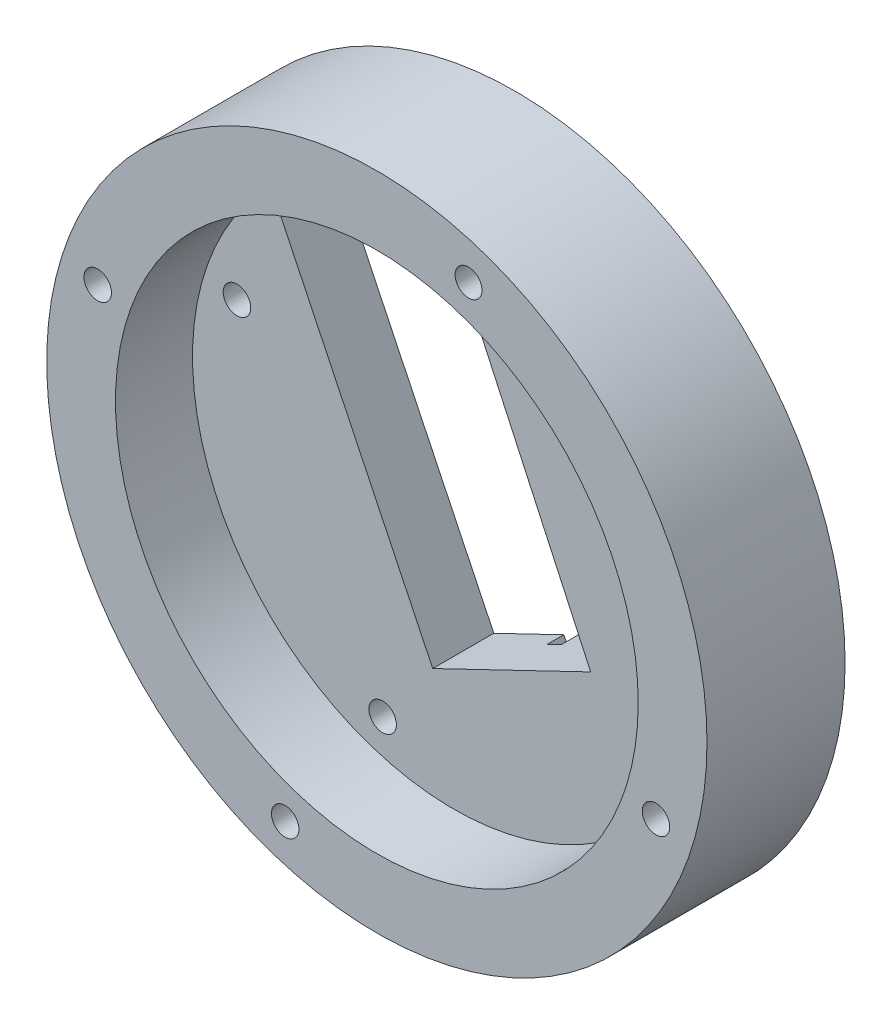
ISO-10303-21;
HEADER;
FILE_DESCRIPTION(('STEP AP214'),'2;1');
FILE_NAME('part.step','',(''),(''),'','','');
FILE_SCHEMA(('AUTOMOTIVE_DESIGN { 1 0 10303 214 1 1 1 1 }'));
ENDSEC;
DATA;
#1=APPLICATION_CONTEXT('core data for automotive mechanical design processes');
#2=APPLICATION_PROTOCOL_DEFINITION('international standard','automotive_design',2000,#1);
#3=PRODUCT_CONTEXT('',#1,'mechanical');
#4=PRODUCT('Part','Part','',(#3));
#5=PRODUCT_RELATED_PRODUCT_CATEGORY('part','',(#4));
#6=PRODUCT_DEFINITION_FORMATION('','',#4);
#7=PRODUCT_DEFINITION_CONTEXT('part definition',#1,'design');
#8=PRODUCT_DEFINITION('design','',#6,#7);
#9=PRODUCT_DEFINITION_SHAPE('','',#8);
#10=(LENGTH_UNIT() NAMED_UNIT(*) SI_UNIT(.MILLI.,.METRE.));
#11=(NAMED_UNIT(*) PLANE_ANGLE_UNIT() SI_UNIT($,.RADIAN.));
#12=(NAMED_UNIT(*) SI_UNIT($,.STERADIAN.) SOLID_ANGLE_UNIT());
#13=UNCERTAINTY_MEASURE_WITH_UNIT(LENGTH_MEASURE(1.E-05),#10,'distance_accuracy_value','');
#14=(GEOMETRIC_REPRESENTATION_CONTEXT(3) GLOBAL_UNCERTAINTY_ASSIGNED_CONTEXT((#13)) GLOBAL_UNIT_ASSIGNED_CONTEXT((#10,
#11,#12)) REPRESENTATION_CONTEXT('',''));
#15=CARTESIAN_POINT('',(0.,0.,0.));
#16=DIRECTION('',(0.,0.,1.));
#17=DIRECTION('',(1.,0.,0.));
#18=AXIS2_PLACEMENT_3D('',#15,#16,#17);
#19=CARTESIAN_POINT('',(0.,0.,25.1));
#20=DIRECTION('',(0.,0.,-1.));
#21=DIRECTION('',(-1.,0.,0.));
#22=AXIS2_PLACEMENT_3D('',#19,#20,#21);
#23=CYLINDRICAL_SURFACE('',#22,60.);
#24=CARTESIAN_POINT('',(0.,0.,25.1));
#25=DIRECTION('',(0.,0.,1.));
#26=DIRECTION('',(1.,0.,0.));
#27=AXIS2_PLACEMENT_3D('',#24,#25,#26);
#28=CIRCLE('',#27,60.);
#29=CARTESIAN_POINT('',(60.,0.,25.1));
#30=VERTEX_POINT('',#29);
#31=EDGE_CURVE('E277',#30,#30,#28,.T.);
#32=ORIENTED_EDGE('',*,*,#31,.F.);
#33=EDGE_LOOP('',(#32));
#34=FACE_BOUND('',#33,.T.);
#35=CARTESIAN_POINT('',(0.,0.,0.));
#36=DIRECTION('',(0.,0.,1.));
#37=DIRECTION('',(1.,0.,0.));
#38=AXIS2_PLACEMENT_3D('',#35,#36,#37);
#39=CIRCLE('',#38,60.);
#40=CARTESIAN_POINT('',(60.,0.,0.));
#41=VERTEX_POINT('',#40);
#42=EDGE_CURVE('E274',#41,#41,#39,.T.);
#43=ORIENTED_EDGE('',*,*,#42,.T.);
#44=EDGE_LOOP('',(#43));
#45=FACE_BOUND('',#44,.T.);
#46=ADVANCED_FACE('F38',(#34,#45),#23,.T.);
#47=CARTESIAN_POINT('',(0.,0.,25.1));
#48=DIRECTION('',(0.,0.,1.));
#49=DIRECTION('',(1.,0.,0.));
#50=AXIS2_PLACEMENT_3D('',#47,#48,#49);
#51=PLANE('',#50);
#52=CARTESIAN_POINT('',(-16.6646971454572,-50.7331044480832,25.1));
#53=DIRECTION('',(0.,0.,1.));
#54=DIRECTION('',(1.,0.,0.));
#55=AXIS2_PLACEMENT_3D('',#52,#53,#54);
#56=CIRCLE('',#55,2.49499865411322);
#57=CARTESIAN_POINT('',(-14.169698491344,-50.7331044480832,25.1));
#58=VERTEX_POINT('',#57);
#59=EDGE_CURVE('E267',#58,#58,#56,.T.);
#60=ORIENTED_EDGE('',*,*,#59,.F.);
#61=EDGE_LOOP('',(#60));
#62=FACE_BOUND('',#61,.T.);
#63=CARTESIAN_POINT('',(-50.7331051137993,16.6646965435116,25.1));
#64=DIRECTION('',(0.,0.,1.));
#65=DIRECTION('',(1.,0.,0.));
#66=AXIS2_PLACEMENT_3D('',#63,#64,#65);
#67=CIRCLE('',#66,2.50000000000001);
#68=CARTESIAN_POINT('',(-48.2331051137992,16.6646965435116,25.1));
#69=VERTEX_POINT('',#68);
#70=EDGE_CURVE('E264',#69,#69,#67,.T.);
#71=ORIENTED_EDGE('',*,*,#70,.F.);
#72=EDGE_LOOP('',(#71));
#73=FACE_BOUND('',#72,.T.);
#74=CARTESIAN_POINT('',(16.6646958777955,50.7331045118536,25.1));
#75=DIRECTION('',(0.,0.,1.));
#76=DIRECTION('',(1.,0.,0.));
#77=AXIS2_PLACEMENT_3D('',#74,#75,#76);
#78=CIRCLE('',#77,2.44444382902341);
#79=CARTESIAN_POINT('',(19.1091397068189,50.7331045118536,25.1));
#80=VERTEX_POINT('',#79);
#81=EDGE_CURVE('E261',#80,#80,#78,.T.);
#82=ORIENTED_EDGE('',*,*,#81,.F.);
#83=EDGE_LOOP('',(#82));
#84=FACE_BOUND('',#83,.T.);
#85=CARTESIAN_POINT('',(50.7331038461375,-16.6646964797411,25.1));
#86=DIRECTION('',(0.,0.,1.));
#87=DIRECTION('',(1.,0.,0.));
#88=AXIS2_PLACEMENT_3D('',#85,#86,#87);
#89=CIRCLE('',#88,2.5);
#90=CARTESIAN_POINT('',(53.2331038461375,-16.6646964797411,25.1));
#91=VERTEX_POINT('',#90);
#92=EDGE_CURVE('E250',#91,#91,#89,.T.);
#93=ORIENTED_EDGE('',*,*,#92,.F.);
#94=EDGE_LOOP('',(#93));
#95=FACE_BOUND('',#94,.T.);
#96=CARTESIAN_POINT('',(0.,0.,25.1));
#97=DIRECTION('',(0.,0.,1.));
#98=DIRECTION('',(1.,0.,0.));
#99=AXIS2_PLACEMENT_3D('',#96,#97,#98);
#100=CIRCLE('',#99,47.5);
#101=CARTESIAN_POINT('',(47.5,0.,25.1));
#102=VERTEX_POINT('',#101);
#103=EDGE_CURVE('E270',#102,#102,#100,.T.);
#104=ORIENTED_EDGE('',*,*,#103,.F.);
#105=EDGE_LOOP('',(#104));
#106=FACE_BOUND('',#105,.T.);
#107=ORIENTED_EDGE('',*,*,#31,.T.);
#108=EDGE_LOOP('',(#107));
#109=FACE_BOUND('',#108,.T.);
#110=ADVANCED_FACE('F348',(#62,#73,#84,#95,#106,#109),#51,.T.);
#111=CARTESIAN_POINT('',(0.,0.,0.));
#112=DIRECTION('',(0.,0.,1.));
#113=DIRECTION('',(1.,0.,0.));
#114=AXIS2_PLACEMENT_3D('',#111,#112,#113);
#115=PLANE('',#114);
#116=CARTESIAN_POINT('',(39.4274126053784,-12.9510283470174,0.));
#117=DIRECTION('',(0.,0.,-1.));
#118=DIRECTION('',(-1.,0.,0.));
#119=AXIS2_PLACEMENT_3D('',#116,#117,#118);
#120=CIRCLE('',#119,2.5);
#121=CARTESIAN_POINT('',(36.9274126053784,-12.9510283470174,0.));
#122=VERTEX_POINT('',#121);
#123=EDGE_CURVE('E184',#122,#122,#120,.T.);
#124=ORIENTED_EDGE('',*,*,#123,.F.);
#125=EDGE_LOOP('',(#124));
#126=FACE_BOUND('',#125,.T.);
#127=CARTESIAN_POINT('',(12.9510283470172,39.4274126053785,0.));
#128=DIRECTION('',(0.,0.,-1.));
#129=DIRECTION('',(-1.,0.,0.));
#130=AXIS2_PLACEMENT_3D('',#127,#128,#129);
#131=CIRCLE('',#130,2.50000000000001);
#132=CARTESIAN_POINT('',(10.4510283470172,39.4274126053785,0.));
#133=VERTEX_POINT('',#132);
#134=EDGE_CURVE('E188',#133,#133,#131,.T.);
#135=ORIENTED_EDGE('',*,*,#134,.F.);
#136=EDGE_LOOP('',(#135));
#137=FACE_BOUND('',#136,.T.);
#138=CARTESIAN_POINT('',(-39.4274126053785,12.9510283470171,0.));
#139=DIRECTION('',(0.,0.,-1.));
#140=DIRECTION('',(-1.,0.,0.));
#141=AXIS2_PLACEMENT_3D('',#138,#139,#140);
#142=CIRCLE('',#141,2.5);
#143=CARTESIAN_POINT('',(-41.9274126053785,12.9510283470171,0.));
#144=VERTEX_POINT('',#143);
#145=EDGE_CURVE('E191',#144,#144,#142,.T.);
#146=ORIENTED_EDGE('',*,*,#145,.F.);
#147=EDGE_LOOP('',(#146));
#148=FACE_BOUND('',#147,.T.);
#149=CARTESIAN_POINT('',(-12.9510283470169,-39.4274126053786,0.));
#150=DIRECTION('',(0.,0.,-1.));
#151=DIRECTION('',(-1.,0.,0.));
#152=AXIS2_PLACEMENT_3D('',#149,#150,#151);
#153=CIRCLE('',#152,2.50000000000001);
#154=CARTESIAN_POINT('',(-15.451028347017,-39.4274126053786,0.));
#155=VERTEX_POINT('',#154);
#156=EDGE_CURVE('E194',#155,#155,#153,.T.);
#157=ORIENTED_EDGE('',*,*,#156,.F.);
#158=EDGE_LOOP('',(#157));
#159=FACE_BOUND('',#158,.T.);
#160=DIRECTION('',(0.901037518718234,0.433741155370446,0.));
#161=VECTOR('',#160,1.);
#162=CARTESIAN_POINT('',(-3.84554959776519,-27.2732838043376,0.));
#163=LINE('',#162,#161);
#164=CARTESIAN_POINT('',(-3.84554959776519,-27.2732838043376,0.));
#165=VERTEX_POINT('',#164);
#166=CARTESIAN_POINT('',(8.88037510619848,-21.1472822010896,0.));
#167=VERTEX_POINT('',#166);
#168=EDGE_CURVE('E205',#165,#167,#163,.T.);
#169=ORIENTED_EDGE('',*,*,#168,.T.);
#170=DIRECTION('',(-0.433741155370446,0.901037518718233,0.));
#171=VECTOR('',#170,1.);
#172=CARTESIAN_POINT('',(8.88037510619848,-21.1472822010896,0.));
#173=LINE('',#172,#171);
#174=CARTESIAN_POINT('',(11.8841005405814,-27.387108140585,0.));
#175=VERTEX_POINT('',#174);
#176=EDGE_CURVE('E146',#175,#167,#173,.T.);
#177=ORIENTED_EDGE('',*,*,#176,.F.);
#178=DIRECTION('',(-0.901037518718233,-0.433741155370445,0.));
#179=VECTOR('',#178,1.);
#180=CARTESIAN_POINT('',(11.8841005405814,-27.387108140585,0.));
#181=LINE('',#180,#179);
#182=CARTESIAN_POINT('',(14.4408286590091,-26.1563511687416,0.));
#183=VERTEX_POINT('',#182);
#184=EDGE_CURVE('E328',#183,#175,#181,.T.);
#185=ORIENTED_EDGE('',*,*,#184,.F.);
#186=DIRECTION('',(0.433741155370446,-0.901037518718233,0.));
#187=VECTOR('',#186,1.);
#188=CARTESIAN_POINT('',(14.4408286590091,-26.1563511687416,0.));
#189=LINE('',#188,#187);
#190=CARTESIAN_POINT('',(11.4371032246262,-19.9165252292462,0.));
#191=VERTEX_POINT('',#190);
#192=EDGE_CURVE('E178',#191,#183,#189,.T.);
#193=ORIENTED_EDGE('',*,*,#192,.F.);
#194=CARTESIAN_POINT('',(24.8593227015866,-13.4553414687139,0.));
#195=VERTEX_POINT('',#194);
#196=EDGE_CURVE('E151',#191,#195,#163,.T.);
#197=ORIENTED_EDGE('',*,*,#196,.T.);
#198=DIRECTION('',(-0.419041540891961,0.907967062732394,0.));
#199=VECTOR('',#198,1.);
#200=CARTESIAN_POINT('',(24.8593227015866,-13.4553414687139,0.));
#201=LINE('',#200,#199);
#202=CARTESIAN_POINT('',(-3.04254959976023,47.001626554702,0.));
#203=VERTEX_POINT('',#202);
#204=EDGE_CURVE('E208',#195,#203,#201,.T.);
#205=ORIENTED_EDGE('',*,*,#204,.T.);
#206=DIRECTION('',(-0.901037518718234,-0.433741155370445,0.));
#207=VECTOR('',#206,1.);
#208=CARTESIAN_POINT('',(-3.04254959976023,47.001626554702,0.));
#209=LINE('',#208,#207);
#210=CARTESIAN_POINT('',(-16.5872007313895,40.4815066830236,0.));
#211=VERTEX_POINT('',#210);
#212=EDGE_CURVE('E198',#203,#211,#209,.T.);
#213=ORIENTED_EDGE('',*,*,#212,.T.);
#214=DIRECTION('',(0.433741155370445,-0.901037518718234,0.));
#215=VECTOR('',#214,1.);
#216=CARTESIAN_POINT('',(-19.6572411960768,46.85909296557,0.));
#217=LINE('',#216,#215);
#218=CARTESIAN_POINT('',(-19.6572411960768,46.85909296557,0.));
#219=VERTEX_POINT('',#218);
#220=EDGE_CURVE('E161',#219,#211,#217,.T.);
#221=ORIENTED_EDGE('',*,*,#220,.F.);
#222=DIRECTION('',(0.901037518718234,0.433741155370444,0.));
#223=VECTOR('',#222,1.);
#224=CARTESIAN_POINT('',(-22.3543810358794,45.5607446437645,0.));
#225=LINE('',#224,#223);
#226=CARTESIAN_POINT('',(-22.3543810358794,45.5607446437645,0.));
#227=VERTEX_POINT('',#226);
#228=EDGE_CURVE('E171',#227,#219,#225,.T.);
#229=ORIENTED_EDGE('',*,*,#228,.F.);
#230=DIRECTION('',(-0.433741155370445,0.901037518718234,0.));
#231=VECTOR('',#230,1.);
#232=CARTESIAN_POINT('',(-19.2843405711922,39.1831583612181,0.));
#233=LINE('',#232,#231);
#234=CARTESIAN_POINT('',(-19.2843405711922,39.1831583612181,0.));
#235=VERTEX_POINT('',#234);
#236=EDGE_CURVE('E168',#235,#227,#233,.T.);
#237=ORIENTED_EDGE('',*,*,#236,.F.);
#238=CARTESIAN_POINT('',(-32.7223817744969,32.7143583430695,0.));
#239=VERTEX_POINT('',#238);
#240=EDGE_CURVE('E202',#235,#239,#209,.T.);
#241=ORIENTED_EDGE('',*,*,#240,.T.);
#242=DIRECTION('',(0.433741155370445,-0.901037518718234,0.));
#243=VECTOR('',#242,1.);
#244=CARTESIAN_POINT('',(-32.7223817744969,32.7143583430695,0.));
#245=LINE('',#244,#243);
#246=EDGE_CURVE('E201',#239,#165,#245,.T.);
#247=ORIENTED_EDGE('',*,*,#246,.T.);
#248=EDGE_LOOP('',(#169,#177,#185,#193,#197,#205,#213,#221,#229,#237,#241,#247));
#249=FACE_BOUND('',#248,.T.);
#250=CARTESIAN_POINT('',(-11.9735029881181,47.2126105483995,0.));
#251=DIRECTION('',(0.,0.,-1.));
#252=DIRECTION('',(-1.,0.,0.));
#253=AXIS2_PLACEMENT_3D('',#250,#251,#252);
#254=CIRCLE('',#253,3.);
#255=CARTESIAN_POINT('',(-14.9735029881181,47.2126105483995,0.));
#256=VERTEX_POINT('',#255);
#257=EDGE_CURVE('E227',#256,#256,#254,.T.);
#258=ORIENTED_EDGE('',*,*,#257,.F.);
#259=EDGE_LOOP('',(#258));
#260=FACE_BOUND('',#259,.T.);
#261=CARTESIAN_POINT('',(-27.3812859892251,40.0292810285461,0.));
#262=DIRECTION('',(0.,0.,-1.));
#263=DIRECTION('',(-1.,0.,0.));
#264=AXIS2_PLACEMENT_3D('',#261,#262,#263);
#265=CIRCLE('',#264,3.);
#266=CARTESIAN_POINT('',(-30.3812859892251,40.0292810285461,0.));
#267=VERTEX_POINT('',#266);
#268=EDGE_CURVE('E233',#267,#267,#265,.T.);
#269=ORIENTED_EDGE('',*,*,#268,.F.);
#270=EDGE_LOOP('',(#269));
#271=FACE_BOUND('',#270,.T.);
#272=CARTESIAN_POINT('',(19.7176566582941,-20.7629026917785,0.));
#273=DIRECTION('',(0.,0.,-1.));
#274=DIRECTION('',(-1.,0.,0.));
#275=AXIS2_PLACEMENT_3D('',#272,#273,#274);
#276=CIRCLE('',#275,3.);
#277=CARTESIAN_POINT('',(16.7176566582941,-20.7629026917785,0.));
#278=VERTEX_POINT('',#277);
#279=EDGE_CURVE('E239',#278,#278,#276,.T.);
#280=ORIENTED_EDGE('',*,*,#279,.F.);
#281=EDGE_LOOP('',(#280));
#282=FACE_BOUND('',#281,.T.);
#283=CARTESIAN_POINT('',(4.30987365718704,-27.9462322116319,0.));
#284=DIRECTION('',(0.,0.,-1.));
#285=DIRECTION('',(-1.,0.,0.));
#286=AXIS2_PLACEMENT_3D('',#283,#284,#285);
#287=CIRCLE('',#286,3.);
#288=CARTESIAN_POINT('',(1.30987365718704,-27.9462322116319,0.));
#289=VERTEX_POINT('',#288);
#290=EDGE_CURVE('E215',#289,#289,#287,.T.);
#291=ORIENTED_EDGE('',*,*,#290,.F.);
#292=EDGE_LOOP('',(#291));
#293=FACE_BOUND('',#292,.T.);
#294=CARTESIAN_POINT('',(-16.6646971454572,-50.7331044480832,0.));
#295=DIRECTION('',(0.,0.,1.));
#296=DIRECTION('',(1.,0.,0.));
#297=AXIS2_PLACEMENT_3D('',#294,#295,#296);
#298=CIRCLE('',#297,2.49499865411322);
#299=CARTESIAN_POINT('',(-14.169698491344,-50.7331044480832,0.));
#300=VERTEX_POINT('',#299);
#301=EDGE_CURVE('E247',#300,#300,#298,.T.);
#302=ORIENTED_EDGE('',*,*,#301,.T.);
#303=EDGE_LOOP('',(#302));
#304=FACE_BOUND('',#303,.T.);
#305=CARTESIAN_POINT('',(-50.7331051137993,16.6646965435116,0.));
#306=DIRECTION('',(0.,0.,1.));
#307=DIRECTION('',(1.,0.,0.));
#308=AXIS2_PLACEMENT_3D('',#305,#306,#307);
#309=CIRCLE('',#308,2.50000000000001);
#310=CARTESIAN_POINT('',(-48.2331051137992,16.6646965435116,0.));
#311=VERTEX_POINT('',#310);
#312=EDGE_CURVE('E251',#311,#311,#309,.T.);
#313=ORIENTED_EDGE('',*,*,#312,.T.);
#314=EDGE_LOOP('',(#313));
#315=FACE_BOUND('',#314,.T.);
#316=CARTESIAN_POINT('',(16.6646958777955,50.7331045118536,0.));
#317=DIRECTION('',(0.,0.,1.));
#318=DIRECTION('',(1.,0.,0.));
#319=AXIS2_PLACEMENT_3D('',#316,#317,#318);
#320=CIRCLE('',#319,2.44444382902341);
#321=CARTESIAN_POINT('',(19.1091397068189,50.7331045118536,0.));
#322=VERTEX_POINT('',#321);
#323=EDGE_CURVE('E254',#322,#322,#320,.T.);
#324=ORIENTED_EDGE('',*,*,#323,.T.);
#325=EDGE_LOOP('',(#324));
#326=FACE_BOUND('',#325,.T.);
#327=CARTESIAN_POINT('',(50.7331038461375,-16.6646964797411,0.));
#328=DIRECTION('',(0.,0.,1.));
#329=DIRECTION('',(1.,0.,0.));
#330=AXIS2_PLACEMENT_3D('',#327,#328,#329);
#331=CIRCLE('',#330,2.5);
#332=CARTESIAN_POINT('',(53.2331038461375,-16.6646964797411,0.));
#333=VERTEX_POINT('',#332);
#334=EDGE_CURVE('E226',#333,#333,#331,.T.);
#335=ORIENTED_EDGE('',*,*,#334,.T.);
#336=EDGE_LOOP('',(#335));
#337=FACE_BOUND('',#336,.T.);
#338=ORIENTED_EDGE('',*,*,#42,.F.);
#339=EDGE_LOOP('',(#338));
#340=FACE_BOUND('',#339,.T.);
#341=ADVANCED_FACE('F302',(#126,#137,#148,#159,#249,#260,#271,#282,#293,#304,#315,#326,#337,
#340),#115,.F.);
#342=CARTESIAN_POINT('',(0.,0.,11.1));
#343=DIRECTION('',(0.,0.,1.));
#344=DIRECTION('',(1.,0.,0.));
#345=AXIS2_PLACEMENT_3D('',#342,#343,#344);
#346=CYLINDRICAL_SURFACE('',#345,47.5);
#347=CARTESIAN_POINT('',(0.,0.,11.1));
#348=DIRECTION('',(0.,0.,1.));
#349=DIRECTION('',(1.,0.,0.));
#350=AXIS2_PLACEMENT_3D('',#347,#348,#349);
#351=CIRCLE('',#350,47.5);
#352=CARTESIAN_POINT('',(47.5,0.,11.1));
#353=VERTEX_POINT('',#352);
#354=EDGE_CURVE('E271',#353,#353,#351,.T.);
#355=ORIENTED_EDGE('',*,*,#354,.F.);
#356=EDGE_LOOP('',(#355));
#357=FACE_BOUND('',#356,.T.);
#358=ORIENTED_EDGE('',*,*,#103,.T.);
#359=EDGE_LOOP('',(#358));
#360=FACE_BOUND('',#359,.T.);
#361=ADVANCED_FACE('F360',(#357,#360),#346,.F.);
#362=CARTESIAN_POINT('',(0.,0.,11.1));
#363=DIRECTION('',(0.,0.,1.));
#364=DIRECTION('',(1.,0.,0.));
#365=AXIS2_PLACEMENT_3D('',#362,#363,#364);
#366=PLANE('',#365);
#367=CARTESIAN_POINT('',(39.4274126053784,-12.9510283470174,11.1));
#368=DIRECTION('',(0.,0.,1.));
#369=DIRECTION('',(1.,0.,0.));
#370=AXIS2_PLACEMENT_3D('',#367,#368,#369);
#371=CIRCLE('',#370,2.5);
#372=CARTESIAN_POINT('',(41.9274126053784,-12.9510283470174,11.1));
#373=VERTEX_POINT('',#372);
#374=EDGE_CURVE('E41',#373,#373,#371,.T.);
#375=ORIENTED_EDGE('',*,*,#374,.F.);
#376=EDGE_LOOP('',(#375));
#377=FACE_BOUND('',#376,.T.);
#378=CARTESIAN_POINT('',(12.9510283470172,39.4274126053785,11.1));
#379=DIRECTION('',(0.,0.,1.));
#380=DIRECTION('',(1.,0.,0.));
#381=AXIS2_PLACEMENT_3D('',#378,#379,#380);
#382=CIRCLE('',#381,2.50000000000001);
#383=CARTESIAN_POINT('',(15.4510283470172,39.4274126053785,11.1));
#384=VERTEX_POINT('',#383);
#385=EDGE_CURVE('E291',#384,#384,#382,.T.);
#386=ORIENTED_EDGE('',*,*,#385,.F.);
#387=EDGE_LOOP('',(#386));
#388=FACE_BOUND('',#387,.T.);
#389=CARTESIAN_POINT('',(-39.4274126053785,12.9510283470171,11.1));
#390=DIRECTION('',(0.,0.,1.));
#391=DIRECTION('',(1.,0.,0.));
#392=AXIS2_PLACEMENT_3D('',#389,#390,#391);
#393=CIRCLE('',#392,2.5);
#394=CARTESIAN_POINT('',(-36.9274126053785,12.9510283470171,11.1));
#395=VERTEX_POINT('',#394);
#396=EDGE_CURVE('E289',#395,#395,#393,.T.);
#397=ORIENTED_EDGE('',*,*,#396,.F.);
#398=EDGE_LOOP('',(#397));
#399=FACE_BOUND('',#398,.T.);
#400=CARTESIAN_POINT('',(-12.9510283470169,-39.4274126053786,11.1));
#401=DIRECTION('',(0.,0.,1.));
#402=DIRECTION('',(1.,0.,0.));
#403=AXIS2_PLACEMENT_3D('',#400,#401,#402);
#404=CIRCLE('',#403,2.50000000000001);
#405=CARTESIAN_POINT('',(-10.4510283470169,-39.4274126053786,11.1));
#406=VERTEX_POINT('',#405);
#407=EDGE_CURVE('E187',#406,#406,#404,.T.);
#408=ORIENTED_EDGE('',*,*,#407,.F.);
#409=EDGE_LOOP('',(#408));
#410=FACE_BOUND('',#409,.T.);
#411=DIRECTION('',(-0.901037518718234,-0.433741155370445,0.));
#412=VECTOR('',#411,1.);
#413=CARTESIAN_POINT('',(-18.94143632709,39.3482254976342,11.1));
#414=LINE('',#413,#412);
#415=CARTESIAN_POINT('',(-3.04254959976023,47.001626554702,11.1));
#416=VERTEX_POINT('',#415);
#417=CARTESIAN_POINT('',(-32.7223817744969,32.7143583430695,11.1));
#418=VERTEX_POINT('',#417);
#419=EDGE_CURVE('E11',#416,#418,#414,.T.);
#420=ORIENTED_EDGE('',*,*,#419,.F.);
#421=DIRECTION('',(-0.419041540891961,0.907967062732394,0.));
#422=VECTOR('',#421,1.);
#423=CARTESIAN_POINT('',(15.3746963368603,7.09567197774308,11.1));
#424=LINE('',#423,#422);
#425=CARTESIAN_POINT('',(24.8593227015866,-13.4553414687139,11.1));
#426=VERTEX_POINT('',#425);
#427=EDGE_CURVE('E46',#426,#416,#424,.T.);
#428=ORIENTED_EDGE('',*,*,#427,.F.);
#429=DIRECTION('',(0.901037518718234,0.433741155370446,0.));
#430=VECTOR('',#429,1.);
#431=CARTESIAN_POINT('',(9.93539584964162,-20.6394166497729,11.1));
#432=LINE('',#431,#430);
#433=CARTESIAN_POINT('',(-3.84554959776519,-27.2732838043376,11.1));
#434=VERTEX_POINT('',#433);
#435=EDGE_CURVE('E284',#434,#426,#432,.T.);
#436=ORIENTED_EDGE('',*,*,#435,.F.);
#437=DIRECTION('',(0.433741155370445,-0.901037518718234,0.));
#438=VECTOR('',#437,1.);
#439=CARTESIAN_POINT('',(-13.7809454474068,-6.63386715456463,11.1));
#440=LINE('',#439,#438);
#441=EDGE_CURVE('E280',#418,#434,#440,.T.);
#442=ORIENTED_EDGE('',*,*,#441,.F.);
#443=EDGE_LOOP('',(#420,#428,#436,#442));
#444=FACE_BOUND('',#443,.T.);
#445=ORIENTED_EDGE('',*,*,#354,.T.);
#446=EDGE_LOOP('',(#445));
#447=FACE_BOUND('',#446,.T.);
#448=ADVANCED_FACE('F318',(#377,#388,#399,#410,#444,#447),#366,.T.);
#449=CARTESIAN_POINT('',(50.7331038461375,-16.6646964797411,0.));
#450=DIRECTION('',(0.,0.,1.));
#451=DIRECTION('',(1.,0.,0.));
#452=AXIS2_PLACEMENT_3D('',#449,#450,#451);
#453=CYLINDRICAL_SURFACE('',#452,2.5);
#454=ORIENTED_EDGE('',*,*,#92,.T.);
#455=EDGE_LOOP('',(#454));
#456=FACE_BOUND('',#455,.T.);
#457=ORIENTED_EDGE('',*,*,#334,.F.);
#458=EDGE_LOOP('',(#457));
#459=FACE_BOUND('',#458,.T.);
#460=ADVANCED_FACE('F372',(#456,#459),#453,.F.);
#461=CARTESIAN_POINT('',(16.6646958777955,50.7331045118536,0.));
#462=DIRECTION('',(0.,0.,1.));
#463=DIRECTION('',(1.,0.,0.));
#464=AXIS2_PLACEMENT_3D('',#461,#462,#463);
#465=CYLINDRICAL_SURFACE('',#464,2.44444382902341);
#466=ORIENTED_EDGE('',*,*,#81,.T.);
#467=EDGE_LOOP('',(#466));
#468=FACE_BOUND('',#467,.T.);
#469=ORIENTED_EDGE('',*,*,#323,.F.);
#470=EDGE_LOOP('',(#469));
#471=FACE_BOUND('',#470,.T.);
#472=ADVANCED_FACE('F376',(#468,#471),#465,.F.);
#473=CARTESIAN_POINT('',(-50.7331051137993,16.6646965435116,0.));
#474=DIRECTION('',(0.,0.,1.));
#475=DIRECTION('',(1.,0.,0.));
#476=AXIS2_PLACEMENT_3D('',#473,#474,#475);
#477=CYLINDRICAL_SURFACE('',#476,2.50000000000001);
#478=ORIENTED_EDGE('',*,*,#70,.T.);
#479=EDGE_LOOP('',(#478));
#480=FACE_BOUND('',#479,.T.);
#481=ORIENTED_EDGE('',*,*,#312,.F.);
#482=EDGE_LOOP('',(#481));
#483=FACE_BOUND('',#482,.T.);
#484=ADVANCED_FACE('F380',(#480,#483),#477,.F.);
#485=CARTESIAN_POINT('',(-16.6646971454572,-50.7331044480832,0.));
#486=DIRECTION('',(0.,0.,1.));
#487=DIRECTION('',(1.,0.,0.));
#488=AXIS2_PLACEMENT_3D('',#485,#486,#487);
#489=CYLINDRICAL_SURFACE('',#488,2.49499865411322);
#490=ORIENTED_EDGE('',*,*,#59,.T.);
#491=EDGE_LOOP('',(#490));
#492=FACE_BOUND('',#491,.T.);
#493=ORIENTED_EDGE('',*,*,#301,.F.);
#494=EDGE_LOOP('',(#493));
#495=FACE_BOUND('',#494,.T.);
#496=ADVANCED_FACE('F384',(#492,#495),#489,.F.);
#497=CARTESIAN_POINT('',(4.30987365718704,-27.9462322116319,6.));
#498=DIRECTION('',(0.,0.,-1.));
#499=DIRECTION('',(-1.,0.,0.));
#500=AXIS2_PLACEMENT_3D('',#497,#498,#499);
#501=CYLINDRICAL_SURFACE('',#500,3.);
#502=CARTESIAN_POINT('',(4.30987365718704,-27.9462322116319,6.));
#503=DIRECTION('',(0.,0.,-1.));
#504=DIRECTION('',(-1.,0.,0.));
#505=AXIS2_PLACEMENT_3D('',#502,#503,#504);
#506=CIRCLE('',#505,3.);
#507=CARTESIAN_POINT('',(1.30987365718704,-27.9462322116319,6.));
#508=VERTEX_POINT('',#507);
#509=EDGE_CURVE('E242',#508,#508,#506,.T.);
#510=ORIENTED_EDGE('',*,*,#509,.F.);
#511=EDGE_LOOP('',(#510));
#512=FACE_BOUND('',#511,.T.);
#513=ORIENTED_EDGE('',*,*,#290,.T.);
#514=EDGE_LOOP('',(#513));
#515=FACE_BOUND('',#514,.T.);
#516=ADVANCED_FACE('F388',(#512,#515),#501,.F.);
#517=CARTESIAN_POINT('',(4.30987365718704,-27.9462322116319,6.));
#518=DIRECTION('',(0.,0.,-1.));
#519=DIRECTION('',(-1.,0.,0.));
#520=AXIS2_PLACEMENT_3D('',#517,#518,#519);
#521=PLANE('',#520);
#522=ORIENTED_EDGE('',*,*,#509,.T.);
#523=EDGE_LOOP('',(#522));
#524=FACE_BOUND('',#523,.T.);
#525=ADVANCED_FACE('F392',(#524),#521,.T.);
#526=CARTESIAN_POINT('',(19.7176566582941,-20.7629026917785,6.));
#527=DIRECTION('',(0.,0.,-1.));
#528=DIRECTION('',(-1.,0.,0.));
#529=AXIS2_PLACEMENT_3D('',#526,#527,#528);
#530=CYLINDRICAL_SURFACE('',#529,3.);
#531=CARTESIAN_POINT('',(19.7176566582941,-20.7629026917785,6.));
#532=DIRECTION('',(0.,0.,-1.));
#533=DIRECTION('',(-1.,0.,0.));
#534=AXIS2_PLACEMENT_3D('',#531,#532,#533);
#535=CIRCLE('',#534,3.);
#536=CARTESIAN_POINT('',(16.7176566582941,-20.7629026917785,6.));
#537=VERTEX_POINT('',#536);
#538=EDGE_CURVE('E236',#537,#537,#535,.T.);
#539=ORIENTED_EDGE('',*,*,#538,.F.);
#540=EDGE_LOOP('',(#539));
#541=FACE_BOUND('',#540,.T.);
#542=ORIENTED_EDGE('',*,*,#279,.T.);
#543=EDGE_LOOP('',(#542));
#544=FACE_BOUND('',#543,.T.);
#545=ADVANCED_FACE('F396',(#541,#544),#530,.F.);
#546=CARTESIAN_POINT('',(19.7176566582941,-20.7629026917785,6.));
#547=DIRECTION('',(0.,0.,-1.));
#548=DIRECTION('',(-1.,0.,0.));
#549=AXIS2_PLACEMENT_3D('',#546,#547,#548);
#550=PLANE('',#549);
#551=ORIENTED_EDGE('',*,*,#538,.T.);
#552=EDGE_LOOP('',(#551));
#553=FACE_BOUND('',#552,.T.);
#554=ADVANCED_FACE('F400',(#553),#550,.T.);
#555=CARTESIAN_POINT('',(-27.3812859892251,40.0292810285461,6.));
#556=DIRECTION('',(0.,0.,-1.));
#557=DIRECTION('',(-1.,0.,0.));
#558=AXIS2_PLACEMENT_3D('',#555,#556,#557);
#559=CYLINDRICAL_SURFACE('',#558,3.);
#560=CARTESIAN_POINT('',(-27.3812859892251,40.0292810285461,6.));
#561=DIRECTION('',(0.,0.,-1.));
#562=DIRECTION('',(-1.,0.,0.));
#563=AXIS2_PLACEMENT_3D('',#560,#561,#562);
#564=CIRCLE('',#563,3.);
#565=CARTESIAN_POINT('',(-30.3812859892251,40.0292810285461,6.));
#566=VERTEX_POINT('',#565);
#567=EDGE_CURVE('E230',#566,#566,#564,.T.);
#568=ORIENTED_EDGE('',*,*,#567,.F.);
#569=EDGE_LOOP('',(#568));
#570=FACE_BOUND('',#569,.T.);
#571=ORIENTED_EDGE('',*,*,#268,.T.);
#572=EDGE_LOOP('',(#571));
#573=FACE_BOUND('',#572,.T.);
#574=ADVANCED_FACE('F404',(#570,#573),#559,.F.);
#575=CARTESIAN_POINT('',(-27.3812859892251,40.0292810285461,6.));
#576=DIRECTION('',(0.,0.,-1.));
#577=DIRECTION('',(-1.,0.,0.));
#578=AXIS2_PLACEMENT_3D('',#575,#576,#577);
#579=PLANE('',#578);
#580=ORIENTED_EDGE('',*,*,#567,.T.);
#581=EDGE_LOOP('',(#580));
#582=FACE_BOUND('',#581,.T.);
#583=ADVANCED_FACE('F408',(#582),#579,.T.);
#584=CARTESIAN_POINT('',(-11.9735029881181,47.2126105483995,6.));
#585=DIRECTION('',(0.,0.,-1.));
#586=DIRECTION('',(-1.,0.,0.));
#587=AXIS2_PLACEMENT_3D('',#584,#585,#586);
#588=CYLINDRICAL_SURFACE('',#587,3.);
#589=CARTESIAN_POINT('',(-11.9735029881181,47.2126105483995,6.));
#590=DIRECTION('',(0.,0.,-1.));
#591=DIRECTION('',(-1.,0.,0.));
#592=AXIS2_PLACEMENT_3D('',#589,#590,#591);
#593=CIRCLE('',#592,3.);
#594=CARTESIAN_POINT('',(-14.9735029881181,47.2126105483995,6.));
#595=VERTEX_POINT('',#594);
#596=EDGE_CURVE('E223',#595,#595,#593,.T.);
#597=ORIENTED_EDGE('',*,*,#596,.F.);
#598=EDGE_LOOP('',(#597));
#599=FACE_BOUND('',#598,.T.);
#600=ORIENTED_EDGE('',*,*,#257,.T.);
#601=EDGE_LOOP('',(#600));
#602=FACE_BOUND('',#601,.T.);
#603=ADVANCED_FACE('F412',(#599,#602),#588,.F.);
#604=CARTESIAN_POINT('',(-11.9735029881181,47.2126105483995,6.));
#605=DIRECTION('',(0.,0.,-1.));
#606=DIRECTION('',(-1.,0.,0.));
#607=AXIS2_PLACEMENT_3D('',#604,#605,#606);
#608=PLANE('',#607);
#609=ORIENTED_EDGE('',*,*,#596,.T.);
#610=EDGE_LOOP('',(#609));
#611=FACE_BOUND('',#610,.T.);
#612=ADVANCED_FACE('F416',(#611),#608,.T.);
#613=CARTESIAN_POINT('',(-3.04254959976023,47.001626554702,0.));
#614=DIRECTION('',(-0.433741155370445,0.901037518718234,0.));
#615=DIRECTION('',(-0.901037518718234,-0.433741155370445,0.));
#616=AXIS2_PLACEMENT_3D('',#613,#614,#615);
#617=PLANE('',#616);
#618=DIRECTION('',(-0.901037518718234,-0.433741155370444,0.));
#619=VECTOR('',#618,1.);
#620=CARTESIAN_POINT('',(-16.5872007313895,40.4815066830236,3.));
#621=LINE('',#620,#619);
#622=CARTESIAN_POINT('',(-16.5872007313895,40.4815066830236,3.));
#623=VERTEX_POINT('',#622);
#624=CARTESIAN_POINT('',(-19.2843405711922,39.1831583612181,3.));
#625=VERTEX_POINT('',#624);
#626=EDGE_CURVE('E158',#623,#625,#621,.T.);
#627=ORIENTED_EDGE('',*,*,#626,.F.);
#628=DIRECTION('',(0.,0.,-1.));
#629=VECTOR('',#628,1.);
#630=CARTESIAN_POINT('',(-16.5872007313895,40.4815066830236,3.));
#631=LINE('',#630,#629);
#632=EDGE_CURVE('E175',#623,#211,#631,.T.);
#633=ORIENTED_EDGE('',*,*,#632,.T.);
#634=ORIENTED_EDGE('',*,*,#212,.F.);
#635=DIRECTION('',(0.,0.,1.));
#636=VECTOR('',#635,1.);
#637=CARTESIAN_POINT('',(-3.04254959976023,47.001626554702,0.));
#638=LINE('',#637,#636);
#639=EDGE_CURVE('E212',#203,#416,#638,.T.);
#640=ORIENTED_EDGE('',*,*,#639,.T.);
#641=ORIENTED_EDGE('',*,*,#419,.T.);
#642=DIRECTION('',(0.,0.,1.));
#643=VECTOR('',#642,1.);
#644=CARTESIAN_POINT('',(-32.7223817744969,32.7143583430695,0.));
#645=LINE('',#644,#643);
#646=EDGE_CURVE('E211',#239,#418,#645,.T.);
#647=ORIENTED_EDGE('',*,*,#646,.F.);
#648=ORIENTED_EDGE('',*,*,#240,.F.);
#649=DIRECTION('',(0.,0.,-1.));
#650=VECTOR('',#649,1.);
#651=CARTESIAN_POINT('',(-19.2843405711922,39.1831583612181,3.));
#652=LINE('',#651,#650);
#653=EDGE_CURVE('E167',#625,#235,#652,.T.);
#654=ORIENTED_EDGE('',*,*,#653,.F.);
#655=EDGE_LOOP('',(#627,#633,#634,#640,#641,#647,#648,#654));
#656=FACE_BOUND('',#655,.T.);
#657=ADVANCED_FACE('F309',(#656),#617,.F.);
#658=CARTESIAN_POINT('',(24.8593227015866,-13.4553414687139,0.));
#659=DIRECTION('',(0.907967062732394,0.419041540891961,0.));
#660=DIRECTION('',(-0.419041540891961,0.907967062732394,0.));
#661=AXIS2_PLACEMENT_3D('',#658,#659,#660);
#662=PLANE('',#661);
#663=ORIENTED_EDGE('',*,*,#427,.T.);
#664=ORIENTED_EDGE('',*,*,#639,.F.);
#665=ORIENTED_EDGE('',*,*,#204,.F.);
#666=DIRECTION('',(0.,0.,1.));
#667=VECTOR('',#666,1.);
#668=CARTESIAN_POINT('',(24.8593227015866,-13.4553414687139,0.));
#669=LINE('',#668,#667);
#670=EDGE_CURVE('E216',#195,#426,#669,.T.);
#671=ORIENTED_EDGE('',*,*,#670,.T.);
#672=EDGE_LOOP('',(#663,#664,#665,#671));
#673=FACE_BOUND('',#672,.T.);
#674=ADVANCED_FACE('F321',(#673),#662,.F.);
#675=CARTESIAN_POINT('',(-3.84554959776519,-27.2732838043376,0.));
#676=DIRECTION('',(0.433741155370446,-0.901037518718234,0.));
#677=DIRECTION('',(0.901037518718234,0.433741155370446,0.));
#678=AXIS2_PLACEMENT_3D('',#675,#676,#677);
#679=PLANE('',#678);
#680=DIRECTION('',(0.901037518718233,0.433741155370445,0.));
#681=VECTOR('',#680,1.);
#682=CARTESIAN_POINT('',(11.4371032246262,-19.9165252292462,3.));
#683=LINE('',#682,#681);
#684=CARTESIAN_POINT('',(8.88037510619848,-21.1472822010896,3.));
#685=VERTEX_POINT('',#684);
#686=CARTESIAN_POINT('',(11.4371032246262,-19.9165252292462,3.));
#687=VERTEX_POINT('',#686);
#688=EDGE_CURVE('E140',#685,#687,#683,.T.);
#689=ORIENTED_EDGE('',*,*,#688,.F.);
#690=DIRECTION('',(0.,0.,-1.));
#691=VECTOR('',#690,1.);
#692=CARTESIAN_POINT('',(8.88037510619848,-21.1472822010896,3.));
#693=LINE('',#692,#691);
#694=EDGE_CURVE('E197',#685,#167,#693,.T.);
#695=ORIENTED_EDGE('',*,*,#694,.T.);
#696=ORIENTED_EDGE('',*,*,#168,.F.);
#697=DIRECTION('',(0.,0.,1.));
#698=VECTOR('',#697,1.);
#699=CARTESIAN_POINT('',(-3.84554959776519,-27.2732838043376,0.));
#700=LINE('',#699,#698);
#701=EDGE_CURVE('E219',#165,#434,#700,.T.);
#702=ORIENTED_EDGE('',*,*,#701,.T.);
#703=ORIENTED_EDGE('',*,*,#435,.T.);
#704=ORIENTED_EDGE('',*,*,#670,.F.);
#705=ORIENTED_EDGE('',*,*,#196,.F.);
#706=DIRECTION('',(0.,0.,-1.));
#707=VECTOR('',#706,1.);
#708=CARTESIAN_POINT('',(11.4371032246262,-19.9165252292462,3.));
#709=LINE('',#708,#707);
#710=EDGE_CURVE('E135',#687,#191,#709,.T.);
#711=ORIENTED_EDGE('',*,*,#710,.F.);
#712=EDGE_LOOP('',(#689,#695,#696,#702,#703,#704,#705,#711));
#713=FACE_BOUND('',#712,.T.);
#714=ADVANCED_FACE('F149',(#713),#679,.F.);
#715=CARTESIAN_POINT('',(-32.7223817744969,32.7143583430695,0.));
#716=DIRECTION('',(-0.901037518718234,-0.433741155370445,0.));
#717=DIRECTION('',(0.433741155370445,-0.901037518718234,0.));
#718=AXIS2_PLACEMENT_3D('',#715,#716,#717);
#719=PLANE('',#718);
#720=ORIENTED_EDGE('',*,*,#441,.T.);
#721=ORIENTED_EDGE('',*,*,#701,.F.);
#722=ORIENTED_EDGE('',*,*,#246,.F.);
#723=ORIENTED_EDGE('',*,*,#646,.T.);
#724=EDGE_LOOP('',(#720,#721,#722,#723));
#725=FACE_BOUND('',#724,.T.);
#726=ADVANCED_FACE('F314',(#725),#719,.F.);
#727=CARTESIAN_POINT('',(-12.9510283470169,-39.4274126053786,81.));
#728=DIRECTION('',(0.,0.,-1.));
#729=DIRECTION('',(-1.,0.,0.));
#730=AXIS2_PLACEMENT_3D('',#727,#728,#729);
#731=CYLINDRICAL_SURFACE('',#730,2.50000000000001);
#732=ORIENTED_EDGE('',*,*,#407,.T.);
#733=EDGE_LOOP('',(#732));
#734=FACE_BOUND('',#733,.T.);
#735=ORIENTED_EDGE('',*,*,#156,.T.);
#736=EDGE_LOOP('',(#735));
#737=FACE_BOUND('',#736,.T.);
#738=ADVANCED_FACE('F425',(#734,#737),#731,.F.);
#739=CARTESIAN_POINT('',(-39.4274126053785,12.9510283470171,81.));
#740=DIRECTION('',(0.,0.,-1.));
#741=DIRECTION('',(-1.,0.,0.));
#742=AXIS2_PLACEMENT_3D('',#739,#740,#741);
#743=CYLINDRICAL_SURFACE('',#742,2.5);
#744=ORIENTED_EDGE('',*,*,#396,.T.);
#745=EDGE_LOOP('',(#744));
#746=FACE_BOUND('',#745,.T.);
#747=ORIENTED_EDGE('',*,*,#145,.T.);
#748=EDGE_LOOP('',(#747));
#749=FACE_BOUND('',#748,.T.);
#750=ADVANCED_FACE('F432',(#746,#749),#743,.F.);
#751=CARTESIAN_POINT('',(12.9510283470172,39.4274126053785,81.));
#752=DIRECTION('',(0.,0.,-1.));
#753=DIRECTION('',(-1.,0.,0.));
#754=AXIS2_PLACEMENT_3D('',#751,#752,#753);
#755=CYLINDRICAL_SURFACE('',#754,2.50000000000001);
#756=ORIENTED_EDGE('',*,*,#385,.T.);
#757=EDGE_LOOP('',(#756));
#758=FACE_BOUND('',#757,.T.);
#759=ORIENTED_EDGE('',*,*,#134,.T.);
#760=EDGE_LOOP('',(#759));
#761=FACE_BOUND('',#760,.T.);
#762=ADVANCED_FACE('F436',(#758,#761),#755,.F.);
#763=CARTESIAN_POINT('',(39.4274126053784,-12.9510283470174,81.));
#764=DIRECTION('',(0.,0.,-1.));
#765=DIRECTION('',(-1.,0.,0.));
#766=AXIS2_PLACEMENT_3D('',#763,#764,#765);
#767=CYLINDRICAL_SURFACE('',#766,2.5);
#768=ORIENTED_EDGE('',*,*,#374,.T.);
#769=EDGE_LOOP('',(#768));
#770=FACE_BOUND('',#769,.T.);
#771=ORIENTED_EDGE('',*,*,#123,.T.);
#772=EDGE_LOOP('',(#771));
#773=FACE_BOUND('',#772,.T.);
#774=ADVANCED_FACE('F345',(#770,#773),#767,.F.);
#775=CARTESIAN_POINT('',(8.88037510619848,-21.1472822010896,3.));
#776=DIRECTION('',(-0.901037518718233,-0.433741155370445,0.));
#777=DIRECTION('',(0.433741155370446,-0.901037518718234,0.));
#778=AXIS2_PLACEMENT_3D('',#775,#776,#777);
#779=PLANE('',#778);
#780=ORIENTED_EDGE('',*,*,#176,.T.);
#781=ORIENTED_EDGE('',*,*,#694,.F.);
#782=DIRECTION('',(-0.433741155370446,0.901037518718233,0.));
#783=VECTOR('',#782,1.);
#784=CARTESIAN_POINT('',(8.88037510619848,-21.1472822010896,3.));
#785=LINE('',#784,#783);
#786=CARTESIAN_POINT('',(11.8841005405814,-27.387108140585,3.));
#787=VERTEX_POINT('',#786);
#788=EDGE_CURVE('E62',#787,#685,#785,.T.);
#789=ORIENTED_EDGE('',*,*,#788,.F.);
#790=DIRECTION('',(0.,0.,-1.));
#791=VECTOR('',#790,1.);
#792=CARTESIAN_POINT('',(11.8841005405814,-27.387108140585,3.));
#793=LINE('',#792,#791);
#794=EDGE_CURVE('E153',#787,#175,#793,.T.);
#795=ORIENTED_EDGE('',*,*,#794,.T.);
#796=EDGE_LOOP('',(#780,#781,#789,#795));
#797=FACE_BOUND('',#796,.T.);
#798=ADVANCED_FACE('F335',(#797),#779,.F.);
#799=CARTESIAN_POINT('',(11.8841005405814,-27.387108140585,3.));
#800=DIRECTION('',(0.433741155370445,-0.901037518718233,0.));
#801=DIRECTION('',(0.901037518718234,0.433741155370446,0.));
#802=AXIS2_PLACEMENT_3D('',#799,#800,#801);
#803=PLANE('',#802);
#804=ORIENTED_EDGE('',*,*,#184,.T.);
#805=ORIENTED_EDGE('',*,*,#794,.F.);
#806=DIRECTION('',(-0.901037518718233,-0.433741155370445,0.));
#807=VECTOR('',#806,1.);
#808=CARTESIAN_POINT('',(11.8841005405814,-27.387108140585,3.));
#809=LINE('',#808,#807);
#810=CARTESIAN_POINT('',(14.4408286590091,-26.1563511687416,3.));
#811=VERTEX_POINT('',#810);
#812=EDGE_CURVE('E139',#811,#787,#809,.T.);
#813=ORIENTED_EDGE('',*,*,#812,.F.);
#814=DIRECTION('',(0.,0.,-1.));
#815=VECTOR('',#814,1.);
#816=CARTESIAN_POINT('',(14.4408286590091,-26.1563511687416,3.));
#817=LINE('',#816,#815);
#818=EDGE_CURVE('E137',#811,#183,#817,.T.);
#819=ORIENTED_EDGE('',*,*,#818,.T.);
#820=EDGE_LOOP('',(#804,#805,#813,#819));
#821=FACE_BOUND('',#820,.T.);
#822=ADVANCED_FACE('F337',(#821),#803,.F.);
#823=CARTESIAN_POINT('',(14.4408286590091,-26.1563511687416,3.));
#824=DIRECTION('',(0.901037518718233,0.433741155370445,0.));
#825=DIRECTION('',(-0.433741155370446,0.901037518718234,0.));
#826=AXIS2_PLACEMENT_3D('',#823,#824,#825);
#827=PLANE('',#826);
#828=ORIENTED_EDGE('',*,*,#192,.T.);
#829=ORIENTED_EDGE('',*,*,#818,.F.);
#830=DIRECTION('',(0.433741155370446,-0.901037518718233,0.));
#831=VECTOR('',#830,1.);
#832=CARTESIAN_POINT('',(14.4408286590091,-26.1563511687416,3.));
#833=LINE('',#832,#831);
#834=EDGE_CURVE('E131',#687,#811,#833,.T.);
#835=ORIENTED_EDGE('',*,*,#834,.F.);
#836=ORIENTED_EDGE('',*,*,#710,.T.);
#837=EDGE_LOOP('',(#828,#829,#835,#836));
#838=FACE_BOUND('',#837,.T.);
#839=ADVANCED_FACE('F133',(#838),#827,.F.);
#840=CARTESIAN_POINT('',(0.,0.,3.));
#841=DIRECTION('',(0.,0.,1.));
#842=DIRECTION('',(1.,0.,0.));
#843=AXIS2_PLACEMENT_3D('',#840,#841,#842);
#844=PLANE('',#843);
#845=ORIENTED_EDGE('',*,*,#688,.T.);
#846=ORIENTED_EDGE('',*,*,#834,.T.);
#847=ORIENTED_EDGE('',*,*,#812,.T.);
#848=ORIENTED_EDGE('',*,*,#788,.T.);
#849=EDGE_LOOP('',(#845,#846,#847,#848));
#850=FACE_BOUND('',#849,.T.);
#851=ADVANCED_FACE('F143',(#850),#844,.F.);
#852=CARTESIAN_POINT('',(-19.6572411960768,46.85909296557,3.));
#853=DIRECTION('',(0.901037518718234,0.433741155370445,0.));
#854=DIRECTION('',(-0.433741155370445,0.901037518718234,0.));
#855=AXIS2_PLACEMENT_3D('',#852,#853,#854);
#856=PLANE('',#855);
#857=ORIENTED_EDGE('',*,*,#220,.T.);
#858=ORIENTED_EDGE('',*,*,#632,.F.);
#859=DIRECTION('',(0.433741155370445,-0.901037518718234,0.));
#860=VECTOR('',#859,1.);
#861=CARTESIAN_POINT('',(-19.6572411960768,46.85909296557,3.));
#862=LINE('',#861,#860);
#863=CARTESIAN_POINT('',(-19.6572411960768,46.85909296557,3.));
#864=VERTEX_POINT('',#863);
#865=EDGE_CURVE('E54',#864,#623,#862,.T.);
#866=ORIENTED_EDGE('',*,*,#865,.F.);
#867=DIRECTION('',(0.,0.,-1.));
#868=VECTOR('',#867,1.);
#869=CARTESIAN_POINT('',(-19.6572411960768,46.85909296557,3.));
#870=LINE('',#869,#868);
#871=EDGE_CURVE('E179',#864,#219,#870,.T.);
#872=ORIENTED_EDGE('',*,*,#871,.T.);
#873=EDGE_LOOP('',(#857,#858,#866,#872));
#874=FACE_BOUND('',#873,.T.);
#875=ADVANCED_FACE('F450',(#874),#856,.F.);
#876=CARTESIAN_POINT('',(-22.3543810358794,45.5607446437645,3.));
#877=DIRECTION('',(-0.433741155370444,0.901037518718234,0.));
#878=DIRECTION('',(-0.901037518718234,-0.433741155370444,0.));
#879=AXIS2_PLACEMENT_3D('',#876,#877,#878);
#880=PLANE('',#879);
#881=ORIENTED_EDGE('',*,*,#228,.T.);
#882=ORIENTED_EDGE('',*,*,#871,.F.);
#883=DIRECTION('',(0.901037518718234,0.433741155370444,0.));
#884=VECTOR('',#883,1.);
#885=CARTESIAN_POINT('',(-22.3543810358794,45.5607446437645,3.));
#886=LINE('',#885,#884);
#887=CARTESIAN_POINT('',(-22.3543810358794,45.5607446437645,3.));
#888=VERTEX_POINT('',#887);
#889=EDGE_CURVE('E164',#888,#864,#886,.T.);
#890=ORIENTED_EDGE('',*,*,#889,.F.);
#891=DIRECTION('',(0.,0.,-1.));
#892=VECTOR('',#891,1.);
#893=CARTESIAN_POINT('',(-22.3543810358794,45.5607446437645,3.));
#894=LINE('',#893,#892);
#895=EDGE_CURVE('E181',#888,#227,#894,.T.);
#896=ORIENTED_EDGE('',*,*,#895,.T.);
#897=EDGE_LOOP('',(#881,#882,#890,#896));
#898=FACE_BOUND('',#897,.T.);
#899=ADVANCED_FACE('F446',(#898),#880,.F.);
#900=CARTESIAN_POINT('',(-19.2843405711922,39.1831583612181,3.));
#901=DIRECTION('',(-0.901037518718234,-0.433741155370445,0.));
#902=DIRECTION('',(0.433741155370445,-0.901037518718234,0.));
#903=AXIS2_PLACEMENT_3D('',#900,#901,#902);
#904=PLANE('',#903);
#905=ORIENTED_EDGE('',*,*,#236,.T.);
#906=ORIENTED_EDGE('',*,*,#895,.F.);
#907=DIRECTION('',(-0.433741155370445,0.901037518718234,0.));
#908=VECTOR('',#907,1.);
#909=CARTESIAN_POINT('',(-19.2843405711922,39.1831583612181,3.));
#910=LINE('',#909,#908);
#911=EDGE_CURVE('E160',#625,#888,#910,.T.);
#912=ORIENTED_EDGE('',*,*,#911,.F.);
#913=ORIENTED_EDGE('',*,*,#653,.T.);
#914=EDGE_LOOP('',(#905,#906,#912,#913));
#915=FACE_BOUND('',#914,.T.);
#916=ADVANCED_FACE('F442',(#915),#904,.F.);
#917=CARTESIAN_POINT('',(0.,0.,3.));
#918=DIRECTION('',(0.,0.,-1.));
#919=DIRECTION('',(-1.,0.,0.));
#920=AXIS2_PLACEMENT_3D('',#917,#918,#919);
#921=PLANE('',#920);
#922=ORIENTED_EDGE('',*,*,#626,.T.);
#923=ORIENTED_EDGE('',*,*,#911,.T.);
#924=ORIENTED_EDGE('',*,*,#889,.T.);
#925=ORIENTED_EDGE('',*,*,#865,.T.);
#926=EDGE_LOOP('',(#922,#923,#924,#925));
#927=FACE_BOUND('',#926,.T.);
#928=ADVANCED_FACE('F445',(#927),#921,.T.);
#929=CLOSED_SHELL('',(#46,#110,#341,#361,#448,#460,#472,#484,#496,#516,#525,#545,#554,#574,#583,
#603,#612,#657,#674,#714,#726,#738,#750,#762,#774,#798,#822,#839,#851,#875,#899,#916,#928));
#930=MANIFOLD_SOLID_BREP('B2',#929);
#931=ADVANCED_BREP_SHAPE_REPRESENTATION('',(#18,#930),#14);
#932=SHAPE_DEFINITION_REPRESENTATION(#9,#931);
ENDSEC;
END-ISO-10303-21;
